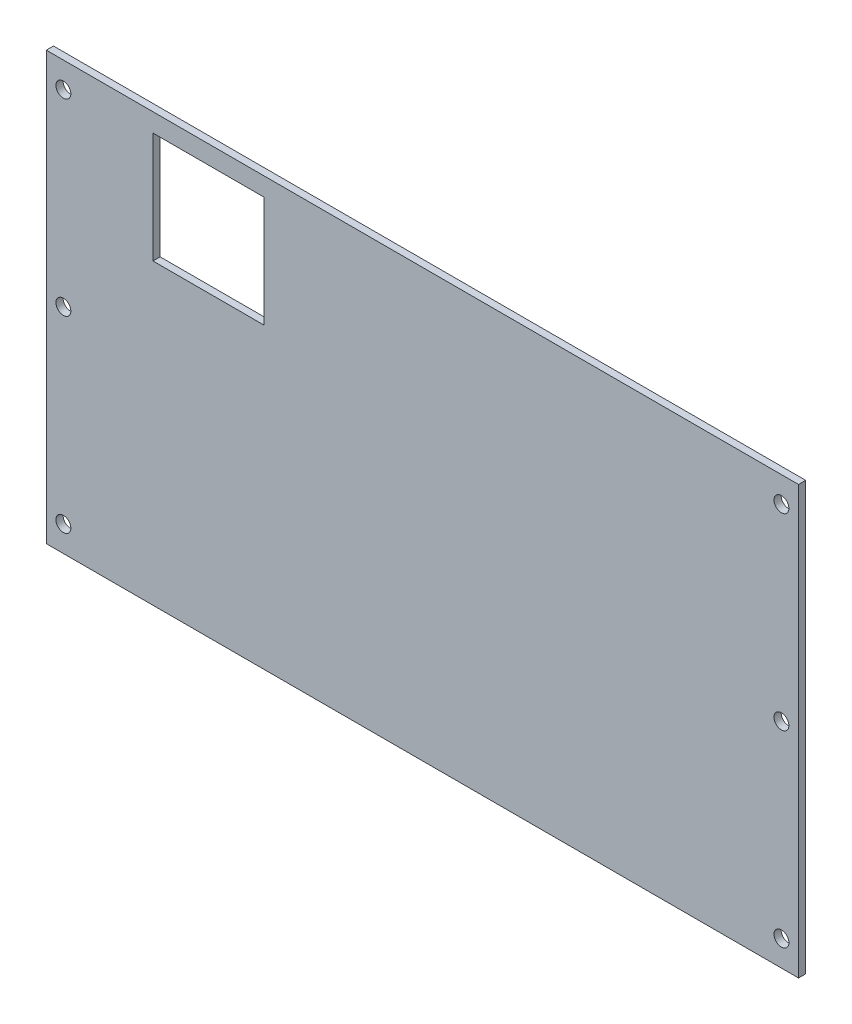
ISO-10303-21;
HEADER;
FILE_DESCRIPTION(('STEP AP214'),'2;1');
FILE_NAME('part.step','',(''),(''),'','','');
FILE_SCHEMA(('AUTOMOTIVE_DESIGN { 1 0 10303 214 1 1 1 1 }'));
ENDSEC;
DATA;
#1=APPLICATION_CONTEXT('core data for automotive mechanical design processes');
#2=APPLICATION_PROTOCOL_DEFINITION('international standard','automotive_design',2000,#1);
#3=PRODUCT_CONTEXT('',#1,'mechanical');
#4=PRODUCT('Part','Part','',(#3));
#5=PRODUCT_RELATED_PRODUCT_CATEGORY('part','',(#4));
#6=PRODUCT_DEFINITION_FORMATION('','',#4);
#7=PRODUCT_DEFINITION_CONTEXT('part definition',#1,'design');
#8=PRODUCT_DEFINITION('design','',#6,#7);
#9=PRODUCT_DEFINITION_SHAPE('','',#8);
#10=(LENGTH_UNIT() NAMED_UNIT(*) SI_UNIT(.MILLI.,.METRE.));
#11=(NAMED_UNIT(*) PLANE_ANGLE_UNIT() SI_UNIT($,.RADIAN.));
#12=(NAMED_UNIT(*) SI_UNIT($,.STERADIAN.) SOLID_ANGLE_UNIT());
#13=UNCERTAINTY_MEASURE_WITH_UNIT(LENGTH_MEASURE(1.E-05),#10,'distance_accuracy_value','');
#14=(GEOMETRIC_REPRESENTATION_CONTEXT(3) GLOBAL_UNCERTAINTY_ASSIGNED_CONTEXT((#13)) GLOBAL_UNIT_ASSIGNED_CONTEXT((#10,
#11,#12)) REPRESENTATION_CONTEXT('',''));
#15=CARTESIAN_POINT('',(0.,0.,0.));
#16=DIRECTION('',(0.,0.,1.));
#17=DIRECTION('',(1.,0.,0.));
#18=AXIS2_PLACEMENT_3D('',#15,#16,#17);
#19=CARTESIAN_POINT('',(0.,0.,2.667));
#20=DIRECTION('',(0.,0.,-1.));
#21=DIRECTION('',(-1.,0.,0.));
#22=AXIS2_PLACEMENT_3D('',#19,#20,#21);
#23=PLANE('',#22);
#24=CARTESIAN_POINT('',(6.35,79.375,2.667));
#25=DIRECTION('',(0.,0.,1.));
#26=DIRECTION('',(1.,0.,0.));
#27=AXIS2_PLACEMENT_3D('',#24,#25,#26);
#28=CIRCLE('',#27,2.7686);
#29=CARTESIAN_POINT('',(9.1186,79.375,2.667));
#30=VERTEX_POINT('',#29);
#31=EDGE_CURVE('E267',#30,#30,#28,.T.);
#32=ORIENTED_EDGE('',*,*,#31,.F.);
#33=EDGE_LOOP('',(#32));
#34=FACE_BOUND('',#33,.T.);
#35=CARTESIAN_POINT('',(6.35,149.225,2.667));
#36=DIRECTION('',(0.,0.,1.));
#37=DIRECTION('',(1.,0.,0.));
#38=AXIS2_PLACEMENT_3D('',#35,#36,#37);
#39=CIRCLE('',#38,2.7686);
#40=CARTESIAN_POINT('',(9.1186,149.225,2.667));
#41=VERTEX_POINT('',#40);
#42=EDGE_CURVE('E273',#41,#41,#39,.T.);
#43=ORIENTED_EDGE('',*,*,#42,.F.);
#44=EDGE_LOOP('',(#43));
#45=FACE_BOUND('',#44,.T.);
#46=CARTESIAN_POINT('',(273.05,9.525,2.667));
#47=DIRECTION('',(0.,0.,1.));
#48=DIRECTION('',(1.,0.,0.));
#49=AXIS2_PLACEMENT_3D('',#46,#47,#48);
#50=CIRCLE('',#49,2.76860000000003);
#51=CARTESIAN_POINT('',(275.8186,9.525,2.667));
#52=VERTEX_POINT('',#51);
#53=EDGE_CURVE('E279',#52,#52,#50,.T.);
#54=ORIENTED_EDGE('',*,*,#53,.F.);
#55=EDGE_LOOP('',(#54));
#56=FACE_BOUND('',#55,.T.);
#57=CARTESIAN_POINT('',(273.05,79.375,2.667));
#58=DIRECTION('',(0.,0.,1.));
#59=DIRECTION('',(1.,0.,0.));
#60=AXIS2_PLACEMENT_3D('',#57,#58,#59);
#61=CIRCLE('',#60,2.76860000000004);
#62=CARTESIAN_POINT('',(275.8186,79.375,2.667));
#63=VERTEX_POINT('',#62);
#64=EDGE_CURVE('E257',#63,#63,#61,.T.);
#65=ORIENTED_EDGE('',*,*,#64,.F.);
#66=EDGE_LOOP('',(#65));
#67=FACE_BOUND('',#66,.T.);
#68=CARTESIAN_POINT('',(273.05,149.225,2.667));
#69=DIRECTION('',(0.,0.,1.));
#70=DIRECTION('',(1.,0.,0.));
#71=AXIS2_PLACEMENT_3D('',#68,#69,#70);
#72=CIRCLE('',#71,2.76860000000004);
#73=CARTESIAN_POINT('',(275.8186,149.225,2.667));
#74=VERTEX_POINT('',#73);
#75=EDGE_CURVE('E252',#74,#74,#72,.T.);
#76=ORIENTED_EDGE('',*,*,#75,.F.);
#77=EDGE_LOOP('',(#76));
#78=FACE_BOUND('',#77,.T.);
#79=CARTESIAN_POINT('',(6.35,9.525,2.667));
#80=DIRECTION('',(0.,0.,1.));
#81=DIRECTION('',(1.,0.,0.));
#82=AXIS2_PLACEMENT_3D('',#79,#80,#81);
#83=CIRCLE('',#82,2.7686);
#84=CARTESIAN_POINT('',(9.1186,9.525,2.667));
#85=VERTEX_POINT('',#84);
#86=EDGE_CURVE('E125',#85,#85,#83,.T.);
#87=ORIENTED_EDGE('',*,*,#86,.F.);
#88=EDGE_LOOP('',(#87));
#89=FACE_BOUND('',#88,.T.);
#90=DIRECTION('',(0.,-1.,0.));
#91=VECTOR('',#90,1.);
#92=CARTESIAN_POINT('',(0.,0.,2.667));
#93=LINE('',#92,#91);
#94=CARTESIAN_POINT('',(0.,158.75,2.667));
#95=VERTEX_POINT('',#94);
#96=CARTESIAN_POINT('',(0.,0.,2.667));
#97=VERTEX_POINT('',#96);
#98=EDGE_CURVE('E145',#95,#97,#93,.T.);
#99=ORIENTED_EDGE('',*,*,#98,.T.);
#100=DIRECTION('',(1.,0.,0.));
#101=VECTOR('',#100,1.);
#102=CARTESIAN_POINT('',(0.,0.,2.667));
#103=LINE('',#102,#101);
#104=CARTESIAN_POINT('',(279.4,0.,2.667));
#105=VERTEX_POINT('',#104);
#106=EDGE_CURVE('E148',#97,#105,#103,.T.);
#107=ORIENTED_EDGE('',*,*,#106,.T.);
#108=DIRECTION('',(0.,1.,0.));
#109=VECTOR('',#108,1.);
#110=CARTESIAN_POINT('',(279.4,0.,2.667));
#111=LINE('',#110,#109);
#112=CARTESIAN_POINT('',(279.4,158.75,2.667));
#113=VERTEX_POINT('',#112);
#114=EDGE_CURVE('E151',#105,#113,#111,.T.);
#115=ORIENTED_EDGE('',*,*,#114,.T.);
#116=DIRECTION('',(-1.,0.,0.));
#117=VECTOR('',#116,1.);
#118=CARTESIAN_POINT('',(0.,158.75,2.667));
#119=LINE('',#118,#117);
#120=EDGE_CURVE('E153',#113,#95,#119,.T.);
#121=ORIENTED_EDGE('',*,*,#120,.T.);
#122=EDGE_LOOP('',(#99,#107,#115,#121));
#123=FACE_BOUND('',#122,.T.);
#124=DIRECTION('',(0.,-1.,0.));
#125=VECTOR('',#124,1.);
#126=CARTESIAN_POINT('',(39.624,0.,2.667));
#127=LINE('',#126,#125);
#128=CARTESIAN_POINT('',(39.624,151.892,2.667));
#129=VERTEX_POINT('',#128);
#130=CARTESIAN_POINT('',(39.624,110.744,2.667));
#131=VERTEX_POINT('',#130);
#132=EDGE_CURVE('E107',#129,#131,#127,.T.);
#133=ORIENTED_EDGE('',*,*,#132,.F.);
#134=DIRECTION('',(-1.,0.,0.));
#135=VECTOR('',#134,1.);
#136=CARTESIAN_POINT('',(0.,151.892,2.667));
#137=LINE('',#136,#135);
#138=CARTESIAN_POINT('',(80.772,151.892,2.667));
#139=VERTEX_POINT('',#138);
#140=EDGE_CURVE('E110',#139,#129,#137,.T.);
#141=ORIENTED_EDGE('',*,*,#140,.F.);
#142=DIRECTION('',(0.,1.,0.));
#143=VECTOR('',#142,1.);
#144=CARTESIAN_POINT('',(80.772,0.,2.667));
#145=LINE('',#144,#143);
#146=CARTESIAN_POINT('',(80.772,110.744,2.667));
#147=VERTEX_POINT('',#146);
#148=EDGE_CURVE('E139',#147,#139,#145,.T.);
#149=ORIENTED_EDGE('',*,*,#148,.F.);
#150=DIRECTION('',(1.,0.,0.));
#151=VECTOR('',#150,1.);
#152=CARTESIAN_POINT('',(0.,110.744,2.667));
#153=LINE('',#152,#151);
#154=EDGE_CURVE('E141',#131,#147,#153,.T.);
#155=ORIENTED_EDGE('',*,*,#154,.F.);
#156=EDGE_LOOP('',(#133,#141,#149,#155));
#157=FACE_BOUND('',#156,.T.);
#158=ADVANCED_FACE('F39',(#34,#45,#56,#67,#78,#89,#123,#157),#23,.F.);
#159=CARTESIAN_POINT('',(0.,0.,0.));
#160=DIRECTION('',(0.,0.,-1.));
#161=DIRECTION('',(-1.,0.,0.));
#162=AXIS2_PLACEMENT_3D('',#159,#160,#161);
#163=PLANE('',#162);
#164=CARTESIAN_POINT('',(6.35,79.375,0.));
#165=DIRECTION('',(0.,0.,1.));
#166=DIRECTION('',(1.,0.,0.));
#167=AXIS2_PLACEMENT_3D('',#164,#165,#166);
#168=CIRCLE('',#167,2.7686);
#169=CARTESIAN_POINT('',(9.1186,79.375,0.));
#170=VERTEX_POINT('',#169);
#171=EDGE_CURVE('E264',#170,#170,#168,.T.);
#172=ORIENTED_EDGE('',*,*,#171,.T.);
#173=EDGE_LOOP('',(#172));
#174=FACE_BOUND('',#173,.T.);
#175=CARTESIAN_POINT('',(6.35,149.225,0.));
#176=DIRECTION('',(0.,0.,1.));
#177=DIRECTION('',(1.,0.,0.));
#178=AXIS2_PLACEMENT_3D('',#175,#176,#177);
#179=CIRCLE('',#178,2.7686);
#180=CARTESIAN_POINT('',(9.1186,149.225,0.));
#181=VERTEX_POINT('',#180);
#182=EDGE_CURVE('E270',#181,#181,#179,.T.);
#183=ORIENTED_EDGE('',*,*,#182,.T.);
#184=EDGE_LOOP('',(#183));
#185=FACE_BOUND('',#184,.T.);
#186=CARTESIAN_POINT('',(273.05,9.525,0.));
#187=DIRECTION('',(0.,0.,1.));
#188=DIRECTION('',(1.,0.,0.));
#189=AXIS2_PLACEMENT_3D('',#186,#187,#188);
#190=CIRCLE('',#189,2.76860000000003);
#191=CARTESIAN_POINT('',(275.8186,9.525,0.));
#192=VERTEX_POINT('',#191);
#193=EDGE_CURVE('E276',#192,#192,#190,.T.);
#194=ORIENTED_EDGE('',*,*,#193,.T.);
#195=EDGE_LOOP('',(#194));
#196=FACE_BOUND('',#195,.T.);
#197=CARTESIAN_POINT('',(273.05,79.375,0.));
#198=DIRECTION('',(0.,0.,1.));
#199=DIRECTION('',(1.,0.,0.));
#200=AXIS2_PLACEMENT_3D('',#197,#198,#199);
#201=CIRCLE('',#200,2.76860000000004);
#202=CARTESIAN_POINT('',(275.8186,79.375,0.));
#203=VERTEX_POINT('',#202);
#204=EDGE_CURVE('E260',#203,#203,#201,.T.);
#205=ORIENTED_EDGE('',*,*,#204,.T.);
#206=EDGE_LOOP('',(#205));
#207=FACE_BOUND('',#206,.T.);
#208=CARTESIAN_POINT('',(273.05,149.225,0.));
#209=DIRECTION('',(0.,0.,1.));
#210=DIRECTION('',(1.,0.,0.));
#211=AXIS2_PLACEMENT_3D('',#208,#209,#210);
#212=CIRCLE('',#211,2.76860000000004);
#213=CARTESIAN_POINT('',(275.8186,149.225,0.));
#214=VERTEX_POINT('',#213);
#215=EDGE_CURVE('E255',#214,#214,#212,.T.);
#216=ORIENTED_EDGE('',*,*,#215,.T.);
#217=EDGE_LOOP('',(#216));
#218=FACE_BOUND('',#217,.T.);
#219=CARTESIAN_POINT('',(6.35,9.525,0.));
#220=DIRECTION('',(0.,0.,1.));
#221=DIRECTION('',(1.,0.,0.));
#222=AXIS2_PLACEMENT_3D('',#219,#220,#221);
#223=CIRCLE('',#222,2.7686);
#224=CARTESIAN_POINT('',(9.1186,9.525,0.));
#225=VERTEX_POINT('',#224);
#226=EDGE_CURVE('E128',#225,#225,#223,.T.);
#227=ORIENTED_EDGE('',*,*,#226,.T.);
#228=EDGE_LOOP('',(#227));
#229=FACE_BOUND('',#228,.T.);
#230=DIRECTION('',(0.,-1.,0.));
#231=VECTOR('',#230,1.);
#232=CARTESIAN_POINT('',(0.,0.,0.));
#233=LINE('',#232,#231);
#234=CARTESIAN_POINT('',(0.,158.75,0.));
#235=VERTEX_POINT('',#234);
#236=CARTESIAN_POINT('',(0.,0.,0.));
#237=VERTEX_POINT('',#236);
#238=EDGE_CURVE('E144',#235,#237,#233,.T.);
#239=ORIENTED_EDGE('',*,*,#238,.F.);
#240=DIRECTION('',(-1.,0.,0.));
#241=VECTOR('',#240,1.);
#242=CARTESIAN_POINT('',(0.,158.75,0.));
#243=LINE('',#242,#241);
#244=CARTESIAN_POINT('',(279.4,158.75,0.));
#245=VERTEX_POINT('',#244);
#246=EDGE_CURVE('E149',#245,#235,#243,.T.);
#247=ORIENTED_EDGE('',*,*,#246,.F.);
#248=DIRECTION('',(0.,1.,0.));
#249=VECTOR('',#248,1.);
#250=CARTESIAN_POINT('',(279.4,0.,0.));
#251=LINE('',#250,#249);
#252=CARTESIAN_POINT('',(279.4,0.,0.));
#253=VERTEX_POINT('',#252);
#254=EDGE_CURVE('E160',#253,#245,#251,.T.);
#255=ORIENTED_EDGE('',*,*,#254,.F.);
#256=DIRECTION('',(1.,0.,0.));
#257=VECTOR('',#256,1.);
#258=CARTESIAN_POINT('',(0.,0.,0.));
#259=LINE('',#258,#257);
#260=EDGE_CURVE('E158',#237,#253,#259,.T.);
#261=ORIENTED_EDGE('',*,*,#260,.F.);
#262=EDGE_LOOP('',(#239,#247,#255,#261));
#263=FACE_BOUND('',#262,.T.);
#264=DIRECTION('',(-1.,0.,0.));
#265=VECTOR('',#264,1.);
#266=CARTESIAN_POINT('',(39.624,151.892,0.));
#267=LINE('',#266,#265);
#268=CARTESIAN_POINT('',(80.772,151.892,0.));
#269=VERTEX_POINT('',#268);
#270=CARTESIAN_POINT('',(39.624,151.892,0.));
#271=VERTEX_POINT('',#270);
#272=EDGE_CURVE('E124',#269,#271,#267,.T.);
#273=ORIENTED_EDGE('',*,*,#272,.T.);
#274=DIRECTION('',(0.,-1.,0.));
#275=VECTOR('',#274,1.);
#276=CARTESIAN_POINT('',(39.624,110.744,0.));
#277=LINE('',#276,#275);
#278=CARTESIAN_POINT('',(39.624,110.744,0.));
#279=VERTEX_POINT('',#278);
#280=EDGE_CURVE('E62',#271,#279,#277,.T.);
#281=ORIENTED_EDGE('',*,*,#280,.T.);
#282=DIRECTION('',(1.,0.,0.));
#283=VECTOR('',#282,1.);
#284=CARTESIAN_POINT('',(39.624,110.744,0.));
#285=LINE('',#284,#283);
#286=CARTESIAN_POINT('',(80.772,110.744,0.));
#287=VERTEX_POINT('',#286);
#288=EDGE_CURVE('E114',#279,#287,#285,.T.);
#289=ORIENTED_EDGE('',*,*,#288,.T.);
#290=DIRECTION('',(0.,1.,0.));
#291=VECTOR('',#290,1.);
#292=CARTESIAN_POINT('',(80.772,110.744,0.));
#293=LINE('',#292,#291);
#294=EDGE_CURVE('E120',#287,#269,#293,.T.);
#295=ORIENTED_EDGE('',*,*,#294,.T.);
#296=EDGE_LOOP('',(#273,#281,#289,#295));
#297=FACE_BOUND('',#296,.T.);
#298=ADVANCED_FACE('F123',(#174,#185,#196,#207,#218,#229,#263,#297),#163,.T.);
#299=CARTESIAN_POINT('',(0.,0.,2.667));
#300=DIRECTION('',(1.,0.,0.));
#301=DIRECTION('',(0.,0.,-1.));
#302=AXIS2_PLACEMENT_3D('',#299,#300,#301);
#303=PLANE('',#302);
#304=ORIENTED_EDGE('',*,*,#238,.T.);
#305=DIRECTION('',(0.,0.,-1.));
#306=VECTOR('',#305,1.);
#307=CARTESIAN_POINT('',(0.,0.,2.667));
#308=LINE('',#307,#306);
#309=EDGE_CURVE('E11',#97,#237,#308,.T.);
#310=ORIENTED_EDGE('',*,*,#309,.F.);
#311=ORIENTED_EDGE('',*,*,#98,.F.);
#312=DIRECTION('',(0.,0.,-1.));
#313=VECTOR('',#312,1.);
#314=CARTESIAN_POINT('',(0.,158.75,2.667));
#315=LINE('',#314,#313);
#316=EDGE_CURVE('E155',#95,#235,#315,.T.);
#317=ORIENTED_EDGE('',*,*,#316,.T.);
#318=EDGE_LOOP('',(#304,#310,#311,#317));
#319=FACE_BOUND('',#318,.T.);
#320=ADVANCED_FACE('F41',(#319),#303,.F.);
#321=CARTESIAN_POINT('',(0.,0.,2.667));
#322=DIRECTION('',(0.,1.,0.));
#323=DIRECTION('',(0.,0.,1.));
#324=AXIS2_PLACEMENT_3D('',#321,#322,#323);
#325=PLANE('',#324);
#326=ORIENTED_EDGE('',*,*,#260,.T.);
#327=DIRECTION('',(0.,0.,-1.));
#328=VECTOR('',#327,1.);
#329=CARTESIAN_POINT('',(279.4,0.,2.667));
#330=LINE('',#329,#328);
#331=EDGE_CURVE('E47',#105,#253,#330,.T.);
#332=ORIENTED_EDGE('',*,*,#331,.F.);
#333=ORIENTED_EDGE('',*,*,#106,.F.);
#334=ORIENTED_EDGE('',*,*,#309,.T.);
#335=EDGE_LOOP('',(#326,#332,#333,#334));
#336=FACE_BOUND('',#335,.T.);
#337=ADVANCED_FACE('F187',(#336),#325,.F.);
#338=CARTESIAN_POINT('',(279.4,0.,2.667));
#339=DIRECTION('',(-1.,0.,0.));
#340=DIRECTION('',(0.,0.,1.));
#341=AXIS2_PLACEMENT_3D('',#338,#339,#340);
#342=PLANE('',#341);
#343=ORIENTED_EDGE('',*,*,#254,.T.);
#344=DIRECTION('',(0.,0.,-1.));
#345=VECTOR('',#344,1.);
#346=CARTESIAN_POINT('',(279.4,158.75,2.667));
#347=LINE('',#346,#345);
#348=EDGE_CURVE('E165',#113,#245,#347,.T.);
#349=ORIENTED_EDGE('',*,*,#348,.F.);
#350=ORIENTED_EDGE('',*,*,#114,.F.);
#351=ORIENTED_EDGE('',*,*,#331,.T.);
#352=EDGE_LOOP('',(#343,#349,#350,#351));
#353=FACE_BOUND('',#352,.T.);
#354=ADVANCED_FACE('F172',(#353),#342,.F.);
#355=CARTESIAN_POINT('',(0.,158.75,2.667));
#356=DIRECTION('',(0.,-1.,0.));
#357=DIRECTION('',(0.,0.,-1.));
#358=AXIS2_PLACEMENT_3D('',#355,#356,#357);
#359=PLANE('',#358);
#360=ORIENTED_EDGE('',*,*,#246,.T.);
#361=ORIENTED_EDGE('',*,*,#316,.F.);
#362=ORIENTED_EDGE('',*,*,#120,.F.);
#363=ORIENTED_EDGE('',*,*,#348,.T.);
#364=EDGE_LOOP('',(#360,#361,#362,#363));
#365=FACE_BOUND('',#364,.T.);
#366=ADVANCED_FACE('F180',(#365),#359,.F.);
#367=CARTESIAN_POINT('',(39.624,110.744,47.752));
#368=DIRECTION('',(1.,0.,0.));
#369=DIRECTION('',(0.,0.,-1.));
#370=AXIS2_PLACEMENT_3D('',#367,#368,#369);
#371=PLANE('',#370);
#372=ORIENTED_EDGE('',*,*,#132,.T.);
#373=DIRECTION('',(0.,0.,-1.));
#374=VECTOR('',#373,1.);
#375=CARTESIAN_POINT('',(39.624,110.744,47.752));
#376=LINE('',#375,#374);
#377=EDGE_CURVE('E103',#131,#279,#376,.T.);
#378=ORIENTED_EDGE('',*,*,#377,.T.);
#379=ORIENTED_EDGE('',*,*,#280,.F.);
#380=DIRECTION('',(0.,0.,-1.));
#381=VECTOR('',#380,1.);
#382=CARTESIAN_POINT('',(39.624,151.892,47.752));
#383=LINE('',#382,#381);
#384=EDGE_CURVE('E134',#129,#271,#383,.T.);
#385=ORIENTED_EDGE('',*,*,#384,.F.);
#386=EDGE_LOOP('',(#372,#378,#379,#385));
#387=FACE_BOUND('',#386,.T.);
#388=ADVANCED_FACE('F105',(#387),#371,.T.);
#389=CARTESIAN_POINT('',(39.624,110.744,47.752));
#390=DIRECTION('',(0.,1.,0.));
#391=DIRECTION('',(0.,0.,1.));
#392=AXIS2_PLACEMENT_3D('',#389,#390,#391);
#393=PLANE('',#392);
#394=ORIENTED_EDGE('',*,*,#154,.T.);
#395=DIRECTION('',(0.,0.,-1.));
#396=VECTOR('',#395,1.);
#397=CARTESIAN_POINT('',(80.772,110.744,47.752));
#398=LINE('',#397,#396);
#399=EDGE_CURVE('E111',#147,#287,#398,.T.);
#400=ORIENTED_EDGE('',*,*,#399,.T.);
#401=ORIENTED_EDGE('',*,*,#288,.F.);
#402=ORIENTED_EDGE('',*,*,#377,.F.);
#403=EDGE_LOOP('',(#394,#400,#401,#402));
#404=FACE_BOUND('',#403,.T.);
#405=ADVANCED_FACE('F115',(#404),#393,.T.);
#406=CARTESIAN_POINT('',(80.772,110.744,47.752));
#407=DIRECTION('',(-1.,0.,0.));
#408=DIRECTION('',(0.,0.,1.));
#409=AXIS2_PLACEMENT_3D('',#406,#407,#408);
#410=PLANE('',#409);
#411=ORIENTED_EDGE('',*,*,#148,.T.);
#412=DIRECTION('',(0.,0.,-1.));
#413=VECTOR('',#412,1.);
#414=CARTESIAN_POINT('',(80.772,151.892,47.752));
#415=LINE('',#414,#413);
#416=EDGE_CURVE('E54',#139,#269,#415,.T.);
#417=ORIENTED_EDGE('',*,*,#416,.T.);
#418=ORIENTED_EDGE('',*,*,#294,.F.);
#419=ORIENTED_EDGE('',*,*,#399,.F.);
#420=EDGE_LOOP('',(#411,#417,#418,#419));
#421=FACE_BOUND('',#420,.T.);
#422=ADVANCED_FACE('F215',(#421),#410,.T.);
#423=CARTESIAN_POINT('',(39.624,151.892,47.752));
#424=DIRECTION('',(0.,-1.,0.));
#425=DIRECTION('',(0.,0.,-1.));
#426=AXIS2_PLACEMENT_3D('',#423,#424,#425);
#427=PLANE('',#426);
#428=ORIENTED_EDGE('',*,*,#140,.T.);
#429=ORIENTED_EDGE('',*,*,#384,.T.);
#430=ORIENTED_EDGE('',*,*,#272,.F.);
#431=ORIENTED_EDGE('',*,*,#416,.F.);
#432=EDGE_LOOP('',(#428,#429,#430,#431));
#433=FACE_BOUND('',#432,.T.);
#434=ADVANCED_FACE('F219',(#433),#427,.T.);
#435=CARTESIAN_POINT('',(6.35,9.525,2.667));
#436=DIRECTION('',(0.,0.,-1.));
#437=DIRECTION('',(-1.,0.,0.));
#438=AXIS2_PLACEMENT_3D('',#435,#436,#437);
#439=CYLINDRICAL_SURFACE('',#438,2.7686);
#440=ORIENTED_EDGE('',*,*,#86,.T.);
#441=EDGE_LOOP('',(#440));
#442=FACE_BOUND('',#441,.T.);
#443=ORIENTED_EDGE('',*,*,#226,.F.);
#444=EDGE_LOOP('',(#443));
#445=FACE_BOUND('',#444,.T.);
#446=ADVANCED_FACE('F224',(#442,#445),#439,.F.);
#447=CARTESIAN_POINT('',(273.05,149.225,2.667));
#448=DIRECTION('',(0.,0.,-1.));
#449=DIRECTION('',(-1.,0.,0.));
#450=AXIS2_PLACEMENT_3D('',#447,#448,#449);
#451=CYLINDRICAL_SURFACE('',#450,2.76860000000004);
#452=ORIENTED_EDGE('',*,*,#75,.T.);
#453=EDGE_LOOP('',(#452));
#454=FACE_BOUND('',#453,.T.);
#455=ORIENTED_EDGE('',*,*,#215,.F.);
#456=EDGE_LOOP('',(#455));
#457=FACE_BOUND('',#456,.T.);
#458=ADVANCED_FACE('F227',(#454,#457),#451,.F.);
#459=CARTESIAN_POINT('',(273.05,79.375,2.667));
#460=DIRECTION('',(0.,0.,-1.));
#461=DIRECTION('',(-1.,0.,0.));
#462=AXIS2_PLACEMENT_3D('',#459,#460,#461);
#463=CYLINDRICAL_SURFACE('',#462,2.76860000000004);
#464=ORIENTED_EDGE('',*,*,#64,.T.);
#465=EDGE_LOOP('',(#464));
#466=FACE_BOUND('',#465,.T.);
#467=ORIENTED_EDGE('',*,*,#204,.F.);
#468=EDGE_LOOP('',(#467));
#469=FACE_BOUND('',#468,.T.);
#470=ADVANCED_FACE('F229',(#466,#469),#463,.F.);
#471=CARTESIAN_POINT('',(273.05,9.525,2.667));
#472=DIRECTION('',(0.,0.,-1.));
#473=DIRECTION('',(-1.,0.,0.));
#474=AXIS2_PLACEMENT_3D('',#471,#472,#473);
#475=CYLINDRICAL_SURFACE('',#474,2.76860000000003);
#476=ORIENTED_EDGE('',*,*,#53,.T.);
#477=EDGE_LOOP('',(#476));
#478=FACE_BOUND('',#477,.T.);
#479=ORIENTED_EDGE('',*,*,#193,.F.);
#480=EDGE_LOOP('',(#479));
#481=FACE_BOUND('',#480,.T.);
#482=ADVANCED_FACE('F232',(#478,#481),#475,.F.);
#483=CARTESIAN_POINT('',(6.35,149.225,2.667));
#484=DIRECTION('',(0.,0.,-1.));
#485=DIRECTION('',(-1.,0.,0.));
#486=AXIS2_PLACEMENT_3D('',#483,#484,#485);
#487=CYLINDRICAL_SURFACE('',#486,2.7686);
#488=ORIENTED_EDGE('',*,*,#42,.T.);
#489=EDGE_LOOP('',(#488));
#490=FACE_BOUND('',#489,.T.);
#491=ORIENTED_EDGE('',*,*,#182,.F.);
#492=EDGE_LOOP('',(#491));
#493=FACE_BOUND('',#492,.T.);
#494=ADVANCED_FACE('F236',(#490,#493),#487,.F.);
#495=CARTESIAN_POINT('',(6.35,79.375,2.667));
#496=DIRECTION('',(0.,0.,-1.));
#497=DIRECTION('',(-1.,0.,0.));
#498=AXIS2_PLACEMENT_3D('',#495,#496,#497);
#499=CYLINDRICAL_SURFACE('',#498,2.7686);
#500=ORIENTED_EDGE('',*,*,#31,.T.);
#501=EDGE_LOOP('',(#500));
#502=FACE_BOUND('',#501,.T.);
#503=ORIENTED_EDGE('',*,*,#171,.F.);
#504=EDGE_LOOP('',(#503));
#505=FACE_BOUND('',#504,.T.);
#506=ADVANCED_FACE('F240',(#502,#505),#499,.F.);
#507=CLOSED_SHELL('',(#158,#298,#320,#337,#354,#366,#388,#405,#422,#434,#446,#458,#470,#482,
#494,#506));
#508=MANIFOLD_SOLID_BREP('B2',#507);
#509=ADVANCED_BREP_SHAPE_REPRESENTATION('',(#18,#508),#14);
#510=SHAPE_DEFINITION_REPRESENTATION(#9,#509);
ENDSEC;
END-ISO-10303-21;
